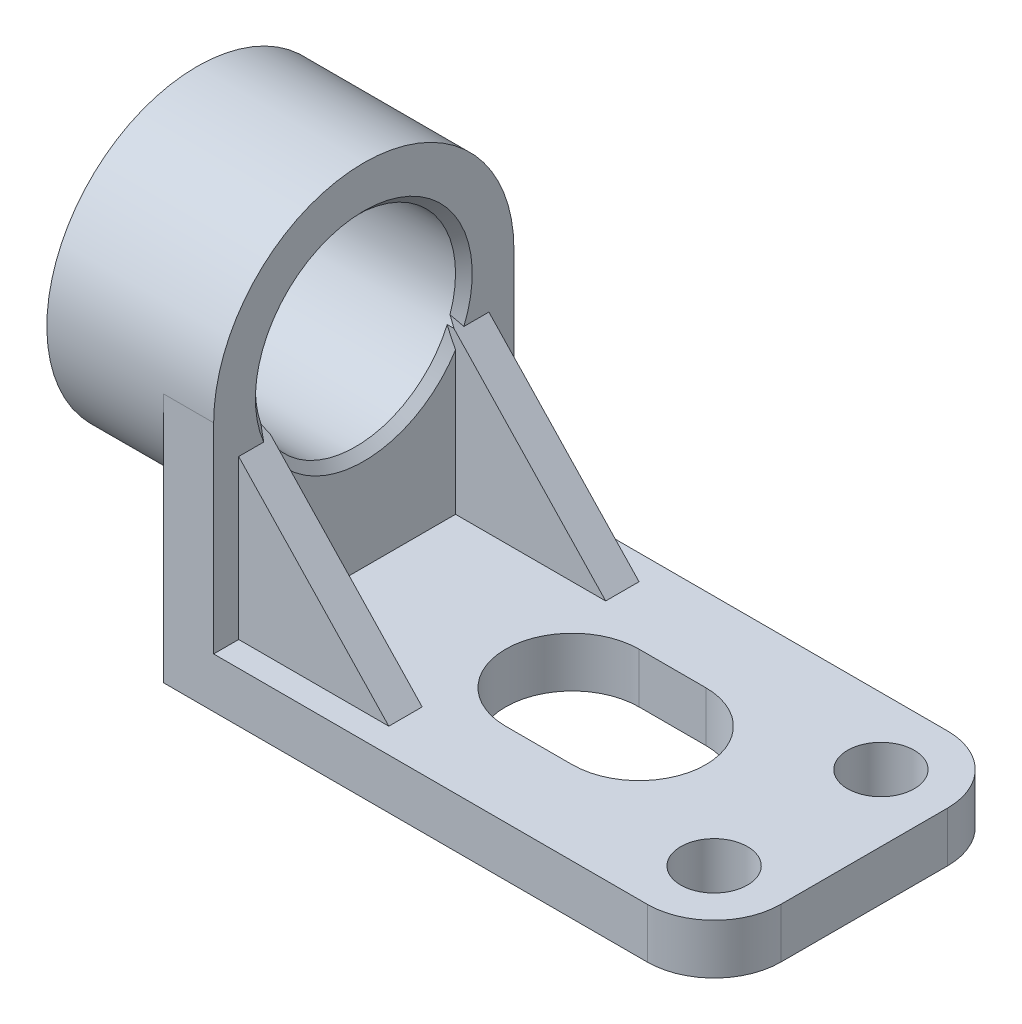
ISO-10303-21;
HEADER;
FILE_DESCRIPTION(('STEP AP214'),'2;1');
FILE_NAME('part.step','',(''),(''),'','','');
FILE_SCHEMA(('AUTOMOTIVE_DESIGN { 1 0 10303 214 1 1 1 1 }'));
ENDSEC;
DATA;
#1=APPLICATION_CONTEXT('core data for automotive mechanical design processes');
#2=APPLICATION_PROTOCOL_DEFINITION('international standard','automotive_design',2000,#1);
#3=PRODUCT_CONTEXT('',#1,'mechanical');
#4=PRODUCT('Part','Part','',(#3));
#5=PRODUCT_RELATED_PRODUCT_CATEGORY('part','',(#4));
#6=PRODUCT_DEFINITION_FORMATION('','',#4);
#7=PRODUCT_DEFINITION_CONTEXT('part definition',#1,'design');
#8=PRODUCT_DEFINITION('design','',#6,#7);
#9=PRODUCT_DEFINITION_SHAPE('','',#8);
#10=(LENGTH_UNIT() NAMED_UNIT(*) SI_UNIT(.MILLI.,.METRE.));
#11=(NAMED_UNIT(*) PLANE_ANGLE_UNIT() SI_UNIT($,.RADIAN.));
#12=(NAMED_UNIT(*) SI_UNIT($,.STERADIAN.) SOLID_ANGLE_UNIT());
#13=UNCERTAINTY_MEASURE_WITH_UNIT(LENGTH_MEASURE(1.E-05),#10,'distance_accuracy_value','');
#14=(GEOMETRIC_REPRESENTATION_CONTEXT(3) GLOBAL_UNCERTAINTY_ASSIGNED_CONTEXT((#13)) GLOBAL_UNIT_ASSIGNED_CONTEXT((#10,
#11,#12)) REPRESENTATION_CONTEXT('',''));
#15=CARTESIAN_POINT('',(0.,0.,0.));
#16=DIRECTION('',(0.,0.,1.));
#17=DIRECTION('',(1.,0.,0.));
#18=AXIS2_PLACEMENT_3D('',#15,#16,#17);
#19=CARTESIAN_POINT('',(66.,6.,36.));
#20=DIRECTION('',(0.,-1.,0.));
#21=DIRECTION('',(1.,0.,0.));
#22=AXIS2_PLACEMENT_3D('',#19,#20,#21);
#23=PLANE('',#22);
#24=DIRECTION('',(1.,0.,0.));
#25=VECTOR('',#24,1.);
#26=CARTESIAN_POINT('',(31.,6.,26.));
#27=LINE('',#26,#25);
#28=CARTESIAN_POINT('',(31.,6.,26.));
#29=VERTEX_POINT('',#28);
#30=CARTESIAN_POINT('',(39.,6.,26.));
#31=VERTEX_POINT('',#30);
#32=EDGE_CURVE('E246',#29,#31,#27,.T.);
#33=ORIENTED_EDGE('',*,*,#32,.F.);
#34=CARTESIAN_POINT('',(31.,6.,18.));
#35=DIRECTION('',(0.,1.,0.));
#36=DIRECTION('',(-1.,0.,0.));
#37=AXIS2_PLACEMENT_3D('',#34,#35,#36);
#38=CIRCLE('',#37,8.);
#39=CARTESIAN_POINT('',(31.,6.,10.));
#40=VERTEX_POINT('',#39);
#41=EDGE_CURVE('E210',#40,#29,#38,.T.);
#42=ORIENTED_EDGE('',*,*,#41,.F.);
#43=DIRECTION('',(-1.,0.,0.));
#44=VECTOR('',#43,1.);
#45=CARTESIAN_POINT('',(31.,6.,10.));
#46=LINE('',#45,#44);
#47=CARTESIAN_POINT('',(39.,6.,10.));
#48=VERTEX_POINT('',#47);
#49=EDGE_CURVE('E230',#48,#40,#46,.T.);
#50=ORIENTED_EDGE('',*,*,#49,.F.);
#51=CARTESIAN_POINT('',(39.,6.,18.));
#52=DIRECTION('',(0.,1.,0.));
#53=DIRECTION('',(-1.,0.,0.));
#54=AXIS2_PLACEMENT_3D('',#51,#52,#53);
#55=CIRCLE('',#54,8.);
#56=EDGE_CURVE('E234',#31,#48,#55,.T.);
#57=ORIENTED_EDGE('',*,*,#56,.F.);
#58=EDGE_LOOP('',(#33,#42,#50,#57));
#59=FACE_BOUND('',#58,.T.);
#60=DIRECTION('',(0.,0.,-1.));
#61=VECTOR('',#60,1.);
#62=CARTESIAN_POINT('',(66.,6.,36.));
#63=LINE('',#62,#61);
#64=CARTESIAN_POINT('',(66.,6.,28.));
#65=VERTEX_POINT('',#64);
#66=CARTESIAN_POINT('',(66.,6.,8.));
#67=VERTEX_POINT('',#66);
#68=EDGE_CURVE('E364',#65,#67,#63,.T.);
#69=ORIENTED_EDGE('',*,*,#68,.T.);
#70=CARTESIAN_POINT('',(58.,6.,8.));
#71=DIRECTION('',(0.,-1.,0.));
#72=DIRECTION('',(1.,0.,0.));
#73=AXIS2_PLACEMENT_3D('',#70,#71,#72);
#74=CIRCLE('',#73,8.);
#75=CARTESIAN_POINT('',(58.,6.,0.));
#76=VERTEX_POINT('',#75);
#77=EDGE_CURVE('E471',#67,#76,#74,.F.);
#78=ORIENTED_EDGE('',*,*,#77,.T.);
#79=DIRECTION('',(-1.,0.,0.));
#80=VECTOR('',#79,1.);
#81=CARTESIAN_POINT('',(66.,6.,0.));
#82=LINE('',#81,#80);
#83=CARTESIAN_POINT('',(6.,5.99999999999999,0.));
#84=VERTEX_POINT('',#83);
#85=EDGE_CURVE('E356',#76,#84,#82,.T.);
#86=ORIENTED_EDGE('',*,*,#85,.T.);
#87=DIRECTION('',(0.,0.,-1.));
#88=VECTOR('',#87,1.);
#89=CARTESIAN_POINT('',(6.,5.99999999999999,36.));
#90=LINE('',#89,#88);
#91=CARTESIAN_POINT('',(6.,5.99999999999999,3.));
#92=VERTEX_POINT('',#91);
#93=EDGE_CURVE('E346',#92,#84,#90,.T.);
#94=ORIENTED_EDGE('',*,*,#93,.F.);
#95=DIRECTION('',(1.,0.,0.));
#96=VECTOR('',#95,1.);
#97=CARTESIAN_POINT('',(24.,6.,3.));
#98=LINE('',#97,#96);
#99=CARTESIAN_POINT('',(24.,5.99999999999999,3.));
#100=VERTEX_POINT('',#99);
#101=EDGE_CURVE('E304',#92,#100,#98,.T.);
#102=ORIENTED_EDGE('',*,*,#101,.T.);
#103=DIRECTION('',(0.,0.,-1.));
#104=VECTOR('',#103,1.);
#105=CARTESIAN_POINT('',(24.,6.,7.));
#106=LINE('',#105,#104);
#107=CARTESIAN_POINT('',(24.,5.99999999999999,7.));
#108=VERTEX_POINT('',#107);
#109=EDGE_CURVE('E312',#108,#100,#106,.T.);
#110=ORIENTED_EDGE('',*,*,#109,.F.);
#111=DIRECTION('',(1.,0.,0.));
#112=VECTOR('',#111,1.);
#113=CARTESIAN_POINT('',(24.,6.,7.));
#114=LINE('',#113,#112);
#115=CARTESIAN_POINT('',(6.,5.99999999999999,7.));
#116=VERTEX_POINT('',#115);
#117=EDGE_CURVE('E292',#116,#108,#114,.T.);
#118=ORIENTED_EDGE('',*,*,#117,.F.);
#119=CARTESIAN_POINT('',(6.,5.99999999999999,29.));
#120=VERTEX_POINT('',#119);
#121=EDGE_CURVE('E365',#120,#116,#90,.T.);
#122=ORIENTED_EDGE('',*,*,#121,.F.);
#123=DIRECTION('',(1.,0.,0.));
#124=VECTOR('',#123,1.);
#125=CARTESIAN_POINT('',(24.,6.,29.));
#126=LINE('',#125,#124);
#127=CARTESIAN_POINT('',(24.,5.99999999999999,29.));
#128=VERTEX_POINT('',#127);
#129=EDGE_CURVE('E269',#120,#128,#126,.T.);
#130=ORIENTED_EDGE('',*,*,#129,.T.);
#131=DIRECTION('',(0.,0.,1.));
#132=VECTOR('',#131,1.);
#133=CARTESIAN_POINT('',(24.,6.,29.));
#134=LINE('',#133,#132);
#135=CARTESIAN_POINT('',(24.,5.99999999999999,33.));
#136=VERTEX_POINT('',#135);
#137=EDGE_CURVE('E272',#128,#136,#134,.T.);
#138=ORIENTED_EDGE('',*,*,#137,.T.);
#139=DIRECTION('',(1.,0.,0.));
#140=VECTOR('',#139,1.);
#141=CARTESIAN_POINT('',(24.,6.,33.));
#142=LINE('',#141,#140);
#143=CARTESIAN_POINT('',(6.,5.99999999999999,33.));
#144=VERTEX_POINT('',#143);
#145=EDGE_CURVE('E265',#144,#136,#142,.T.);
#146=ORIENTED_EDGE('',*,*,#145,.F.);
#147=CARTESIAN_POINT('',(6.,5.99999999999999,36.));
#148=VERTEX_POINT('',#147);
#149=EDGE_CURVE('E361',#148,#144,#90,.T.);
#150=ORIENTED_EDGE('',*,*,#149,.F.);
#151=DIRECTION('',(-1.,0.,0.));
#152=VECTOR('',#151,1.);
#153=CARTESIAN_POINT('',(66.,6.,36.));
#154=LINE('',#153,#152);
#155=CARTESIAN_POINT('',(58.,6.,36.));
#156=VERTEX_POINT('',#155);
#157=EDGE_CURVE('E340',#156,#148,#154,.T.);
#158=ORIENTED_EDGE('',*,*,#157,.F.);
#159=CARTESIAN_POINT('',(58.,6.,28.));
#160=DIRECTION('',(0.,-1.,0.));
#161=DIRECTION('',(1.,0.,0.));
#162=AXIS2_PLACEMENT_3D('',#159,#160,#161);
#163=CIRCLE('',#162,8.);
#164=EDGE_CURVE('E468',#156,#65,#163,.F.);
#165=ORIENTED_EDGE('',*,*,#164,.T.);
#166=EDGE_LOOP('',(#69,#78,#86,#94,#102,#110,#118,#122,#130,#138,#146,#150,#158,#165));
#167=FACE_BOUND('',#166,.T.);
#168=CARTESIAN_POINT('',(58.,6.,28.));
#169=DIRECTION('',(0.,1.,0.));
#170=DIRECTION('',(0.,0.,1.));
#171=AXIS2_PLACEMENT_3D('',#168,#169,#170);
#172=CIRCLE('',#171,4.00000000000001);
#173=CARTESIAN_POINT('',(58.,6.,32.));
#174=VERTEX_POINT('',#173);
#175=EDGE_CURVE('E718',#174,#174,#172,.T.);
#176=ORIENTED_EDGE('',*,*,#175,.F.);
#177=EDGE_LOOP('',(#176));
#178=FACE_BOUND('',#177,.T.);
#179=CARTESIAN_POINT('',(58.,6.,8.));
#180=DIRECTION('',(0.,1.,0.));
#181=DIRECTION('',(0.,0.,1.));
#182=AXIS2_PLACEMENT_3D('',#179,#180,#181);
#183=CIRCLE('',#182,4.00000000000001);
#184=CARTESIAN_POINT('',(58.,6.,12.));
#185=VERTEX_POINT('',#184);
#186=EDGE_CURVE('E713',#185,#185,#183,.T.);
#187=ORIENTED_EDGE('',*,*,#186,.F.);
#188=EDGE_LOOP('',(#187));
#189=FACE_BOUND('',#188,.T.);
#190=ADVANCED_FACE('F49',(#59,#167,#178,#189),#23,.F.);
#191=CARTESIAN_POINT('',(6.,30.,18.));
#192=DIRECTION('',(1.,0.,0.));
#193=DIRECTION('',(0.,0.,-1.));
#194=AXIS2_PLACEMENT_3D('',#191,#192,#193);
#195=CONICAL_SURFACE('',#194,13.,0.785398163397447);
#196=CARTESIAN_POINT('',(4.52683805481986,26.5550042754679,7.));
#197=CARTESIAN_POINT('',(4.61741219515265,26.2520037073432,7.));
#198=CARTESIAN_POINT('',(4.71789676239011,25.9521383609206,7.));
#199=CARTESIAN_POINT('',(4.93564132333157,25.3593713241902,7.));
#200=CARTESIAN_POINT('',(5.05285946883212,25.066454326674,7.));
#201=CARTESIAN_POINT('',(5.30143816416191,24.4869283681925,7.));
#202=CARTESIAN_POINT('',(5.43279182713468,24.2003164166389,7.));
#203=CARTESIAN_POINT('',(5.7077856612305,23.6321598015335,7.));
#204=CARTESIAN_POINT('',(5.85145528681877,23.3506293516368,7.));
#205=CARTESIAN_POINT('',(6.,23.0717967697244,7.));
#206=B_SPLINE_CURVE_WITH_KNOTS('',3,(#196,#197,#198,#199,#200,#201,#202,#203,#204,#205),
.UNSPECIFIED.,.F.,.F.,(4,2,2,2,4),(0.,0.948337859718804,1.89434431502451,2.83989194275113,
3.78776761231351),.UNSPECIFIED.);
#207=CARTESIAN_POINT('',(4.99999999999998,25.2041684766872,7.));
#208=VERTEX_POINT('',#207);
#209=CARTESIAN_POINT('',(6.,23.0717967697244,7.));
#210=VERTEX_POINT('',#209);
#211=EDGE_CURVE('E439',#208,#210,#206,.T.);
#212=ORIENTED_EDGE('',*,*,#211,.F.);
#213=CARTESIAN_POINT('',(4.99999999999998,30.,18.));
#214=DIRECTION('',(-1.,0.,0.));
#215=DIRECTION('',(0.,0.,1.));
#216=AXIS2_PLACEMENT_3D('',#213,#214,#215);
#217=CIRCLE('',#216,12.);
#218=CARTESIAN_POINT('',(4.99999999999998,25.2041684766872,29.));
#219=VERTEX_POINT('',#218);
#220=EDGE_CURVE('E377',#219,#208,#217,.F.);
#221=ORIENTED_EDGE('',*,*,#220,.F.);
#222=CARTESIAN_POINT('',(6.,23.0717967697244,29.));
#223=CARTESIAN_POINT('',(5.85145528681877,23.3506293516368,29.));
#224=CARTESIAN_POINT('',(5.7077856612305,23.6321598015335,29.));
#225=CARTESIAN_POINT('',(5.43279182713468,24.2003164166389,29.));
#226=CARTESIAN_POINT('',(5.30143816416191,24.4869283681925,29.));
#227=CARTESIAN_POINT('',(5.05285946883212,25.066454326674,29.));
#228=CARTESIAN_POINT('',(4.93564132333156,25.3593713241902,29.));
#229=CARTESIAN_POINT('',(4.71789676239011,25.9521383609206,29.));
#230=CARTESIAN_POINT('',(4.61741219515265,26.2520037073432,29.));
#231=CARTESIAN_POINT('',(4.52683805481986,26.5550042754679,29.));
#232=B_SPLINE_CURVE_WITH_KNOTS('',3,(#222,#223,#224,#225,#226,#227,#228,#229,#230,#231),
.UNSPECIFIED.,.F.,.F.,(4,2,2,2,4),(0.,0.947875669562385,1.893423297289,2.83942975259471,
3.78776761231352),.UNSPECIFIED.);
#233=CARTESIAN_POINT('',(6.,23.0717967697244,29.));
#234=VERTEX_POINT('',#233);
#235=EDGE_CURVE('E398',#234,#219,#232,.T.);
#236=ORIENTED_EDGE('',*,*,#235,.F.);
#237=CARTESIAN_POINT('',(6.,30.,18.));
#238=DIRECTION('',(-1.,0.,0.));
#239=DIRECTION('',(0.,-1.,0.));
#240=AXIS2_PLACEMENT_3D('',#237,#238,#239);
#241=CIRCLE('',#240,13.);
#242=EDGE_CURVE('E394',#210,#234,#241,.T.);
#243=ORIENTED_EDGE('',*,*,#242,.F.);
#244=EDGE_LOOP('',(#212,#221,#236,#243));
#245=FACE_BOUND('',#244,.T.);
#246=ADVANCED_FACE('F522',(#245),#195,.F.);
#247=CARTESIAN_POINT('',(6.,5.99999999999999,36.));
#248=DIRECTION('',(-1.,0.,0.));
#249=DIRECTION('',(0.,-1.,0.));
#250=AXIS2_PLACEMENT_3D('',#247,#248,#249);
#251=PLANE('',#250);
#252=DIRECTION('',(0.,-1.,0.));
#253=VECTOR('',#252,1.);
#254=CARTESIAN_POINT('',(6.,5.99999999999999,7.));
#255=LINE('',#254,#253);
#256=EDGE_CURVE('E289',#210,#116,#255,.T.);
#257=ORIENTED_EDGE('',*,*,#256,.F.);
#258=ORIENTED_EDGE('',*,*,#242,.T.);
#259=DIRECTION('',(0.,-1.,0.));
#260=VECTOR('',#259,1.);
#261=CARTESIAN_POINT('',(6.,5.99999999999999,29.));
#262=LINE('',#261,#260);
#263=EDGE_CURVE('E261',#234,#120,#262,.T.);
#264=ORIENTED_EDGE('',*,*,#263,.T.);
#265=ORIENTED_EDGE('',*,*,#121,.T.);
#266=EDGE_LOOP('',(#257,#258,#264,#265));
#267=FACE_BOUND('',#266,.T.);
#268=ADVANCED_FACE('F507',(#267),#251,.F.);
#269=CARTESIAN_POINT('',(-14.,30.,18.));
#270=DIRECTION('',(1.,0.,0.));
#271=DIRECTION('',(0.,1.,0.));
#272=AXIS2_PLACEMENT_3D('',#269,#270,#271);
#273=PLANE('',#272);
#274=CARTESIAN_POINT('',(-14.,30.,18.));
#275=DIRECTION('',(1.,0.,0.));
#276=DIRECTION('',(0.,1.,0.));
#277=AXIS2_PLACEMENT_3D('',#274,#275,#276);
#278=CIRCLE('',#277,13.);
#279=CARTESIAN_POINT('',(-14.,43.,18.));
#280=VERTEX_POINT('',#279);
#281=EDGE_CURVE('E386',#280,#280,#278,.T.);
#282=ORIENTED_EDGE('',*,*,#281,.T.);
#283=EDGE_LOOP('',(#282));
#284=FACE_BOUND('',#283,.T.);
#285=CARTESIAN_POINT('',(-14.,30.,18.));
#286=DIRECTION('',(1.,0.,0.));
#287=DIRECTION('',(0.,1.,0.));
#288=AXIS2_PLACEMENT_3D('',#285,#286,#287);
#289=CIRCLE('',#288,18.);
#290=CARTESIAN_POINT('',(-14.,48.,18.));
#291=VERTEX_POINT('',#290);
#292=EDGE_CURVE('E317',#291,#291,#289,.T.);
#293=ORIENTED_EDGE('',*,*,#292,.F.);
#294=EDGE_LOOP('',(#293));
#295=FACE_BOUND('',#294,.T.);
#296=ADVANCED_FACE('F565',(#284,#295),#273,.F.);
#297=CARTESIAN_POINT('',(0.,30.,36.));
#298=DIRECTION('',(1.,0.,0.));
#299=DIRECTION('',(0.,1.,0.));
#300=AXIS2_PLACEMENT_3D('',#297,#298,#299);
#301=PLANE('',#300);
#302=DIRECTION('',(0.,-1.,0.));
#303=VECTOR('',#302,1.);
#304=CARTESIAN_POINT('',(0.,30.,36.));
#305=LINE('',#304,#303);
#306=CARTESIAN_POINT('',(0.,30.,36.));
#307=VERTEX_POINT('',#306);
#308=CARTESIAN_POINT('',(0.,0.,36.));
#309=VERTEX_POINT('',#308);
#310=EDGE_CURVE('E333',#307,#309,#305,.T.);
#311=ORIENTED_EDGE('',*,*,#310,.F.);
#312=CARTESIAN_POINT('',(0.,30.,18.));
#313=DIRECTION('',(1.,0.,0.));
#314=DIRECTION('',(0.,1.,0.));
#315=AXIS2_PLACEMENT_3D('',#312,#313,#314);
#316=CIRCLE('',#315,18.);
#317=CARTESIAN_POINT('',(0.,30.,0.));
#318=VERTEX_POINT('',#317);
#319=EDGE_CURVE('E321',#307,#318,#316,.T.);
#320=ORIENTED_EDGE('',*,*,#319,.T.);
#321=DIRECTION('',(0.,-1.,0.));
#322=VECTOR('',#321,1.);
#323=CARTESIAN_POINT('',(0.,30.,0.));
#324=LINE('',#323,#322);
#325=CARTESIAN_POINT('',(0.,0.,0.));
#326=VERTEX_POINT('',#325);
#327=EDGE_CURVE('E350',#318,#326,#324,.T.);
#328=ORIENTED_EDGE('',*,*,#327,.T.);
#329=DIRECTION('',(0.,0.,-1.));
#330=VECTOR('',#329,1.);
#331=CARTESIAN_POINT('',(0.,0.,36.));
#332=LINE('',#331,#330);
#333=EDGE_CURVE('E373',#309,#326,#332,.T.);
#334=ORIENTED_EDGE('',*,*,#333,.F.);
#335=EDGE_LOOP('',(#311,#320,#328,#334));
#336=FACE_BOUND('',#335,.T.);
#337=ADVANCED_FACE('F537',(#336),#301,.F.);
#338=CARTESIAN_POINT('',(0.,0.,36.));
#339=DIRECTION('',(0.,1.,0.));
#340=DIRECTION('',(0.,0.,1.));
#341=AXIS2_PLACEMENT_3D('',#338,#339,#340);
#342=PLANE('',#341);
#343=CARTESIAN_POINT('',(58.,0.,8.));
#344=DIRECTION('',(0.,1.,0.));
#345=DIRECTION('',(0.,0.,1.));
#346=AXIS2_PLACEMENT_3D('',#343,#344,#345);
#347=CIRCLE('',#346,4.00000000000001);
#348=CARTESIAN_POINT('',(58.,0.,12.));
#349=VERTEX_POINT('',#348);
#350=EDGE_CURVE('E710',#349,#349,#347,.T.);
#351=ORIENTED_EDGE('',*,*,#350,.T.);
#352=EDGE_LOOP('',(#351));
#353=FACE_BOUND('',#352,.T.);
#354=CARTESIAN_POINT('',(58.,0.,28.));
#355=DIRECTION('',(0.,1.,0.));
#356=DIRECTION('',(0.,0.,1.));
#357=AXIS2_PLACEMENT_3D('',#354,#355,#356);
#358=CIRCLE('',#357,4.00000000000001);
#359=CARTESIAN_POINT('',(58.,0.,32.));
#360=VERTEX_POINT('',#359);
#361=EDGE_CURVE('E237',#360,#360,#358,.T.);
#362=ORIENTED_EDGE('',*,*,#361,.T.);
#363=EDGE_LOOP('',(#362));
#364=FACE_BOUND('',#363,.T.);
#365=DIRECTION('',(-1.,0.,0.));
#366=VECTOR('',#365,1.);
#367=CARTESIAN_POINT('',(31.,0.,10.));
#368=LINE('',#367,#366);
#369=CARTESIAN_POINT('',(39.,0.,10.));
#370=VERTEX_POINT('',#369);
#371=CARTESIAN_POINT('',(31.,0.,10.));
#372=VERTEX_POINT('',#371);
#373=EDGE_CURVE('E216',#370,#372,#368,.T.);
#374=ORIENTED_EDGE('',*,*,#373,.T.);
#375=CARTESIAN_POINT('',(31.,0.,18.));
#376=DIRECTION('',(0.,1.,0.));
#377=DIRECTION('',(-1.,0.,0.));
#378=AXIS2_PLACEMENT_3D('',#375,#376,#377);
#379=CIRCLE('',#378,8.);
#380=CARTESIAN_POINT('',(31.,0.,26.));
#381=VERTEX_POINT('',#380);
#382=EDGE_CURVE('E207',#372,#381,#379,.T.);
#383=ORIENTED_EDGE('',*,*,#382,.T.);
#384=DIRECTION('',(1.,0.,0.));
#385=VECTOR('',#384,1.);
#386=CARTESIAN_POINT('',(31.,0.,26.));
#387=LINE('',#386,#385);
#388=CARTESIAN_POINT('',(39.,0.,26.));
#389=VERTEX_POINT('',#388);
#390=EDGE_CURVE('E220',#381,#389,#387,.T.);
#391=ORIENTED_EDGE('',*,*,#390,.T.);
#392=CARTESIAN_POINT('',(39.,0.,18.));
#393=DIRECTION('',(0.,1.,0.));
#394=DIRECTION('',(-1.,0.,0.));
#395=AXIS2_PLACEMENT_3D('',#392,#393,#394);
#396=CIRCLE('',#395,8.);
#397=EDGE_CURVE('E225',#389,#370,#396,.T.);
#398=ORIENTED_EDGE('',*,*,#397,.T.);
#399=EDGE_LOOP('',(#374,#383,#391,#398));
#400=FACE_BOUND('',#399,.T.);
#401=DIRECTION('',(1.,0.,0.));
#402=VECTOR('',#401,1.);
#403=CARTESIAN_POINT('',(0.,0.,0.));
#404=LINE('',#403,#402);
#405=CARTESIAN_POINT('',(58.,0.,0.));
#406=VERTEX_POINT('',#405);
#407=EDGE_CURVE('E353',#326,#406,#404,.T.);
#408=ORIENTED_EDGE('',*,*,#407,.T.);
#409=CARTESIAN_POINT('',(58.,0.,8.));
#410=DIRECTION('',(0.,1.,0.));
#411=DIRECTION('',(0.,0.,1.));
#412=AXIS2_PLACEMENT_3D('',#409,#410,#411);
#413=CIRCLE('',#412,8.);
#414=CARTESIAN_POINT('',(66.,0.,8.));
#415=VERTEX_POINT('',#414);
#416=EDGE_CURVE('E58',#406,#415,#413,.F.);
#417=ORIENTED_EDGE('',*,*,#416,.T.);
#418=DIRECTION('',(0.,0.,-1.));
#419=VECTOR('',#418,1.);
#420=CARTESIAN_POINT('',(66.,0.,36.));
#421=LINE('',#420,#419);
#422=CARTESIAN_POINT('',(66.,0.,28.));
#423=VERTEX_POINT('',#422);
#424=EDGE_CURVE('E369',#423,#415,#421,.T.);
#425=ORIENTED_EDGE('',*,*,#424,.F.);
#426=CARTESIAN_POINT('',(58.,0.,28.));
#427=DIRECTION('',(0.,1.,0.));
#428=DIRECTION('',(0.,0.,1.));
#429=AXIS2_PLACEMENT_3D('',#426,#427,#428);
#430=CIRCLE('',#429,8.);
#431=CARTESIAN_POINT('',(58.,0.,36.));
#432=VERTEX_POINT('',#431);
#433=EDGE_CURVE('E65',#423,#432,#430,.F.);
#434=ORIENTED_EDGE('',*,*,#433,.T.);
#435=DIRECTION('',(1.,0.,0.));
#436=VECTOR('',#435,1.);
#437=CARTESIAN_POINT('',(0.,0.,36.));
#438=LINE('',#437,#436);
#439=EDGE_CURVE('E337',#309,#432,#438,.T.);
#440=ORIENTED_EDGE('',*,*,#439,.F.);
#441=ORIENTED_EDGE('',*,*,#333,.T.);
#442=EDGE_LOOP('',(#408,#417,#425,#434,#440,#441));
#443=FACE_BOUND('',#442,.T.);
#444=ADVANCED_FACE('F227',(#353,#364,#400,#443),#342,.F.);
#445=CARTESIAN_POINT('',(66.,0.,36.));
#446=DIRECTION('',(-1.,0.,0.));
#447=DIRECTION('',(0.,0.,1.));
#448=AXIS2_PLACEMENT_3D('',#445,#446,#447);
#449=PLANE('',#448);
#450=ORIENTED_EDGE('',*,*,#424,.T.);
#451=DIRECTION('',(0.,1.,0.));
#452=VECTOR('',#451,1.);
#453=CARTESIAN_POINT('',(66.,0.,8.));
#454=LINE('',#453,#452);
#455=EDGE_CURVE('E464',#415,#67,#454,.T.);
#456=ORIENTED_EDGE('',*,*,#455,.T.);
#457=ORIENTED_EDGE('',*,*,#68,.F.);
#458=DIRECTION('',(0.,1.,0.));
#459=VECTOR('',#458,1.);
#460=CARTESIAN_POINT('',(66.,0.,28.));
#461=LINE('',#460,#459);
#462=EDGE_CURVE('E461',#65,#423,#461,.F.);
#463=ORIENTED_EDGE('',*,*,#462,.T.);
#464=EDGE_LOOP('',(#450,#456,#457,#463));
#465=FACE_BOUND('',#464,.T.);
#466=ADVANCED_FACE('F482',(#465),#449,.F.);
#467=DIRECTION('',(0.,0.,1.));
#468=VECTOR('',#467,1.);
#469=CARTESIAN_POINT('',(6.,25.,29.));
#470=LINE('',#469,#468);
#471=CARTESIAN_POINT('',(6.,25.,30.));
#472=VERTEX_POINT('',#471);
#473=CARTESIAN_POINT('',(6.,25.,33.));
#474=VERTEX_POINT('',#473);
#475=EDGE_CURVE('E285',#472,#474,#470,.T.);
#476=ORIENTED_EDGE('',*,*,#475,.F.);
#477=CARTESIAN_POINT('',(6.,30.,18.));
#478=DIRECTION('',(-1.,0.,0.));
#479=DIRECTION('',(0.,-1.,0.));
#480=AXIS2_PLACEMENT_3D('',#477,#478,#479);
#481=CIRCLE('',#480,13.);
#482=CARTESIAN_POINT('',(6.,25.,5.99999999999996));
#483=VERTEX_POINT('',#482);
#484=EDGE_CURVE('E390',#472,#483,#481,.T.);
#485=ORIENTED_EDGE('',*,*,#484,.T.);
#486=DIRECTION('',(0.,0.,-1.));
#487=VECTOR('',#486,1.);
#488=CARTESIAN_POINT('',(6.,25.,7.));
#489=LINE('',#488,#487);
#490=CARTESIAN_POINT('',(6.,25.,3.));
#491=VERTEX_POINT('',#490);
#492=EDGE_CURVE('E301',#483,#491,#489,.T.);
#493=ORIENTED_EDGE('',*,*,#492,.T.);
#494=DIRECTION('',(0.,-1.,0.));
#495=VECTOR('',#494,1.);
#496=CARTESIAN_POINT('',(6.,5.99999999999999,3.));
#497=LINE('',#496,#495);
#498=EDGE_CURVE('E288',#491,#92,#497,.T.);
#499=ORIENTED_EDGE('',*,*,#498,.T.);
#500=ORIENTED_EDGE('',*,*,#93,.T.);
#501=DIRECTION('',(0.,1.,0.));
#502=VECTOR('',#501,1.);
#503=CARTESIAN_POINT('',(6.,5.99999999999999,0.));
#504=LINE('',#503,#502);
#505=CARTESIAN_POINT('',(6.,30.,0.));
#506=VERTEX_POINT('',#505);
#507=EDGE_CURVE('E334',#84,#506,#504,.T.);
#508=ORIENTED_EDGE('',*,*,#507,.T.);
#509=CARTESIAN_POINT('',(6.,30.,18.));
#510=DIRECTION('',(1.,0.,0.));
#511=DIRECTION('',(0.,1.,0.));
#512=AXIS2_PLACEMENT_3D('',#509,#510,#511);
#513=CIRCLE('',#512,18.);
#514=CARTESIAN_POINT('',(6.,30.,36.));
#515=VERTEX_POINT('',#514);
#516=EDGE_CURVE('E316',#506,#515,#513,.T.);
#517=ORIENTED_EDGE('',*,*,#516,.T.);
#518=DIRECTION('',(0.,1.,0.));
#519=VECTOR('',#518,1.);
#520=CARTESIAN_POINT('',(6.,5.99999999999999,36.));
#521=LINE('',#520,#519);
#522=EDGE_CURVE('E343',#148,#515,#521,.T.);
#523=ORIENTED_EDGE('',*,*,#522,.F.);
#524=ORIENTED_EDGE('',*,*,#149,.T.);
#525=DIRECTION('',(0.,-1.,0.));
#526=VECTOR('',#525,1.);
#527=CARTESIAN_POINT('',(6.,5.99999999999999,33.));
#528=LINE('',#527,#526);
#529=EDGE_CURVE('E255',#474,#144,#528,.T.);
#530=ORIENTED_EDGE('',*,*,#529,.F.);
#531=EDGE_LOOP('',(#476,#485,#493,#499,#500,#508,#517,#523,#524,#530));
#532=FACE_BOUND('',#531,.T.);
#533=ADVANCED_FACE('F496',(#532),#251,.F.);
#534=CARTESIAN_POINT('',(0.,0.,36.));
#535=DIRECTION('',(0.,0.,1.));
#536=DIRECTION('',(1.,0.,0.));
#537=AXIS2_PLACEMENT_3D('',#534,#535,#536);
#538=PLANE('',#537);
#539=ORIENTED_EDGE('',*,*,#439,.T.);
#540=DIRECTION('',(0.,1.,0.));
#541=VECTOR('',#540,1.);
#542=CARTESIAN_POINT('',(58.,6.,36.));
#543=LINE('',#542,#541);
#544=EDGE_CURVE('E11',#432,#156,#543,.T.);
#545=ORIENTED_EDGE('',*,*,#544,.T.);
#546=ORIENTED_EDGE('',*,*,#157,.T.);
#547=ORIENTED_EDGE('',*,*,#522,.T.);
#548=DIRECTION('',(-1.,0.,0.));
#549=VECTOR('',#548,1.);
#550=CARTESIAN_POINT('',(6.,30.,36.));
#551=LINE('',#550,#549);
#552=EDGE_CURVE('E329',#515,#307,#551,.T.);
#553=ORIENTED_EDGE('',*,*,#552,.T.);
#554=ORIENTED_EDGE('',*,*,#310,.T.);
#555=EDGE_LOOP('',(#539,#545,#546,#547,#553,#554));
#556=FACE_BOUND('',#555,.T.);
#557=ADVANCED_FACE('F532',(#556),#538,.T.);
#558=CARTESIAN_POINT('',(0.,0.,0.));
#559=DIRECTION('',(0.,0.,1.));
#560=DIRECTION('',(1.,0.,0.));
#561=AXIS2_PLACEMENT_3D('',#558,#559,#560);
#562=PLANE('',#561);
#563=ORIENTED_EDGE('',*,*,#85,.F.);
#564=DIRECTION('',(0.,1.,0.));
#565=VECTOR('',#564,1.);
#566=CARTESIAN_POINT('',(58.,0.,0.));
#567=LINE('',#566,#565);
#568=EDGE_CURVE('E73',#76,#406,#567,.F.);
#569=ORIENTED_EDGE('',*,*,#568,.T.);
#570=ORIENTED_EDGE('',*,*,#407,.F.);
#571=ORIENTED_EDGE('',*,*,#327,.F.);
#572=DIRECTION('',(-1.,0.,0.));
#573=VECTOR('',#572,1.);
#574=CARTESIAN_POINT('',(6.,30.,0.));
#575=LINE('',#574,#573);
#576=EDGE_CURVE('E328',#506,#318,#575,.T.);
#577=ORIENTED_EDGE('',*,*,#576,.F.);
#578=ORIENTED_EDGE('',*,*,#507,.F.);
#579=EDGE_LOOP('',(#563,#569,#570,#571,#577,#578));
#580=FACE_BOUND('',#579,.T.);
#581=ADVANCED_FACE('F491',(#580),#562,.F.);
#582=CARTESIAN_POINT('',(-14.,30.,18.));
#583=DIRECTION('',(1.,0.,0.));
#584=DIRECTION('',(0.,1.,0.));
#585=AXIS2_PLACEMENT_3D('',#582,#583,#584);
#586=CYLINDRICAL_SURFACE('',#585,18.);
#587=ORIENTED_EDGE('',*,*,#292,.T.);
#588=EDGE_LOOP('',(#587));
#589=FACE_BOUND('',#588,.T.);
#590=ORIENTED_EDGE('',*,*,#552,.F.);
#591=ORIENTED_EDGE('',*,*,#516,.F.);
#592=ORIENTED_EDGE('',*,*,#576,.T.);
#593=ORIENTED_EDGE('',*,*,#319,.F.);
#594=EDGE_LOOP('',(#590,#591,#592,#593));
#595=FACE_BOUND('',#594,.T.);
#596=ADVANCED_FACE('F535',(#589,#595),#586,.T.);
#597=CARTESIAN_POINT('',(6.,25.,7.));
#598=DIRECTION('',(-0.725952683905827,-0.687744647910783,0.));
#599=DIRECTION('',(0.687744647910783,-0.725952683905827,0.));
#600=AXIS2_PLACEMENT_3D('',#597,#598,#599);
#601=PLANE('',#600);
#602=DIRECTION('',(-0.687744647910783,0.725952683905827,0.));
#603=VECTOR('',#602,1.);
#604=CARTESIAN_POINT('',(6.,25.,3.));
#605=LINE('',#604,#603);
#606=EDGE_CURVE('E293',#100,#491,#605,.T.);
#607=ORIENTED_EDGE('',*,*,#606,.T.);
#608=ORIENTED_EDGE('',*,*,#492,.F.);
#609=CARTESIAN_POINT('',(73.6216216216176,-46.3783783783741,18.));
#610=DIRECTION('',(-0.725952683905827,-0.687744647910783,0.));
#611=DIRECTION('',(0.687744647910783,-0.725952683905827,0.));
#612=AXIS2_PLACEMENT_3D('',#609,#610,#611);
#613=ELLIPSE('',#612,111.056303542885,25.8106410069405);
#614=CARTESIAN_POINT('',(4.99999999999998,26.0555555555556,6.66680283306197));
#615=VERTEX_POINT('',#614);
#616=EDGE_CURVE('E447',#483,#615,#613,.F.);
#617=ORIENTED_EDGE('',*,*,#616,.T.);
#618=CARTESIAN_POINT('',(1.26315789473684,30.,18.));
#619=DIRECTION('',(-0.725952683905827,-0.687744647910783,0.));
#620=DIRECTION('',(-0.687744647910783,0.725952683905827,0.));
#621=AXIS2_PLACEMENT_3D('',#618,#619,#620);
#622=ELLIPSE('',#621,16.5300029410136,12.);
#623=CARTESIAN_POINT('',(5.80657723261208,25.2041684766872,7.));
#624=VERTEX_POINT('',#623);
#625=EDGE_CURVE('E458',#624,#615,#622,.F.);
#626=ORIENTED_EDGE('',*,*,#625,.F.);
#627=DIRECTION('',(-0.687744647910783,0.725952683905827,0.));
#628=VECTOR('',#627,1.);
#629=CARTESIAN_POINT('',(6.,25.,7.));
#630=LINE('',#629,#628);
#631=EDGE_CURVE('E297',#108,#624,#630,.T.);
#632=ORIENTED_EDGE('',*,*,#631,.F.);
#633=ORIENTED_EDGE('',*,*,#109,.T.);
#634=EDGE_LOOP('',(#607,#608,#617,#626,#632,#633));
#635=FACE_BOUND('',#634,.T.);
#636=ADVANCED_FACE('F435',(#635),#601,.F.);
#637=CARTESIAN_POINT('',(0.,0.,7.));
#638=DIRECTION('',(0.,0.,1.));
#639=DIRECTION('',(1.,0.,0.));
#640=AXIS2_PLACEMENT_3D('',#637,#638,#639);
#641=PLANE('',#640);
#642=ORIENTED_EDGE('',*,*,#631,.T.);
#643=DIRECTION('',(-1.,0.,0.));
#644=VECTOR('',#643,1.);
#645=CARTESIAN_POINT('',(-14.,25.2041684766872,7.));
#646=LINE('',#645,#644);
#647=EDGE_CURVE('E454',#208,#624,#646,.F.);
#648=ORIENTED_EDGE('',*,*,#647,.F.);
#649=ORIENTED_EDGE('',*,*,#211,.T.);
#650=ORIENTED_EDGE('',*,*,#256,.T.);
#651=ORIENTED_EDGE('',*,*,#117,.T.);
#652=EDGE_LOOP('',(#642,#648,#649,#650,#651));
#653=FACE_BOUND('',#652,.T.);
#654=ADVANCED_FACE('F431',(#653),#641,.T.);
#655=CARTESIAN_POINT('',(0.,0.,3.));
#656=DIRECTION('',(0.,0.,1.));
#657=DIRECTION('',(1.,0.,0.));
#658=AXIS2_PLACEMENT_3D('',#655,#656,#657);
#659=PLANE('',#658);
#660=ORIENTED_EDGE('',*,*,#498,.F.);
#661=ORIENTED_EDGE('',*,*,#606,.F.);
#662=ORIENTED_EDGE('',*,*,#101,.F.);
#663=EDGE_LOOP('',(#660,#661,#662));
#664=FACE_BOUND('',#663,.T.);
#665=ADVANCED_FACE('F429',(#664),#659,.F.);
#666=CARTESIAN_POINT('',(6.,25.,29.));
#667=DIRECTION('',(0.725952683905827,0.687744647910783,0.));
#668=DIRECTION('',(-0.687744647910783,0.725952683905827,0.));
#669=AXIS2_PLACEMENT_3D('',#666,#667,#668);
#670=PLANE('',#669);
#671=DIRECTION('',(-0.687744647910783,0.725952683905827,0.));
#672=VECTOR('',#671,1.);
#673=CARTESIAN_POINT('',(6.,25.,33.));
#674=LINE('',#673,#672);
#675=EDGE_CURVE('E276',#136,#474,#674,.T.);
#676=ORIENTED_EDGE('',*,*,#675,.F.);
#677=ORIENTED_EDGE('',*,*,#137,.F.);
#678=DIRECTION('',(-0.687744647910783,0.725952683905827,0.));
#679=VECTOR('',#678,1.);
#680=CARTESIAN_POINT('',(6.,25.,29.));
#681=LINE('',#680,#679);
#682=CARTESIAN_POINT('',(5.80657723261209,25.2041684766872,29.));
#683=VERTEX_POINT('',#682);
#684=EDGE_CURVE('E264',#128,#683,#681,.T.);
#685=ORIENTED_EDGE('',*,*,#684,.T.);
#686=CARTESIAN_POINT('',(1.26315789473684,30.,18.));
#687=DIRECTION('',(0.725952683905827,0.687744647910783,0.));
#688=DIRECTION('',(-0.687744647910783,0.725952683905827,0.));
#689=AXIS2_PLACEMENT_3D('',#686,#687,#688);
#690=ELLIPSE('',#689,16.5300029410136,12.);
#691=CARTESIAN_POINT('',(4.99999999999998,26.0555555555556,29.333197166938));
#692=VERTEX_POINT('',#691);
#693=EDGE_CURVE('E451',#683,#692,#690,.F.);
#694=ORIENTED_EDGE('',*,*,#693,.T.);
#695=CARTESIAN_POINT('',(73.6216216216176,-46.3783783783741,18.));
#696=DIRECTION('',(0.725952683905827,0.687744647910783,0.));
#697=DIRECTION('',(0.687744647910783,-0.725952683905827,0.));
#698=AXIS2_PLACEMENT_3D('',#695,#696,#697);
#699=ELLIPSE('',#698,111.056303542885,25.8106410069405);
#700=EDGE_CURVE('E408',#692,#472,#699,.T.);
#701=ORIENTED_EDGE('',*,*,#700,.T.);
#702=ORIENTED_EDGE('',*,*,#475,.T.);
#703=EDGE_LOOP('',(#676,#677,#685,#694,#701,#702));
#704=FACE_BOUND('',#703,.T.);
#705=ADVANCED_FACE('F420',(#704),#670,.T.);
#706=CARTESIAN_POINT('',(0.,0.,29.));
#707=DIRECTION('',(0.,0.,-1.));
#708=DIRECTION('',(1.,0.,0.));
#709=AXIS2_PLACEMENT_3D('',#706,#707,#708);
#710=PLANE('',#709);
#711=ORIENTED_EDGE('',*,*,#263,.F.);
#712=ORIENTED_EDGE('',*,*,#235,.T.);
#713=DIRECTION('',(-1.,0.,0.));
#714=VECTOR('',#713,1.);
#715=CARTESIAN_POINT('',(-14.,25.2041684766872,29.));
#716=LINE('',#715,#714);
#717=EDGE_CURVE('E446',#219,#683,#716,.F.);
#718=ORIENTED_EDGE('',*,*,#717,.T.);
#719=ORIENTED_EDGE('',*,*,#684,.F.);
#720=ORIENTED_EDGE('',*,*,#129,.F.);
#721=EDGE_LOOP('',(#711,#712,#718,#719,#720));
#722=FACE_BOUND('',#721,.T.);
#723=ADVANCED_FACE('F414',(#722),#710,.T.);
#724=CARTESIAN_POINT('',(0.,0.,33.));
#725=DIRECTION('',(0.,0.,-1.));
#726=DIRECTION('',(1.,0.,0.));
#727=AXIS2_PLACEMENT_3D('',#724,#725,#726);
#728=PLANE('',#727);
#729=ORIENTED_EDGE('',*,*,#529,.T.);
#730=ORIENTED_EDGE('',*,*,#145,.T.);
#731=ORIENTED_EDGE('',*,*,#675,.T.);
#732=EDGE_LOOP('',(#729,#730,#731));
#733=FACE_BOUND('',#732,.T.);
#734=ADVANCED_FACE('F419',(#733),#728,.F.);
#735=CARTESIAN_POINT('',(-14.,30.,18.));
#736=DIRECTION('',(-1.,0.,0.));
#737=DIRECTION('',(0.,0.,1.));
#738=AXIS2_PLACEMENT_3D('',#735,#736,#737);
#739=CYLINDRICAL_SURFACE('',#738,12.);
#740=CARTESIAN_POINT('',(-13.,30.,18.));
#741=DIRECTION('',(1.,0.,0.));
#742=DIRECTION('',(0.,0.,-1.));
#743=AXIS2_PLACEMENT_3D('',#740,#741,#742);
#744=CIRCLE('',#743,12.);
#745=CARTESIAN_POINT('',(-13.,30.,5.99999999999998));
#746=VERTEX_POINT('',#745);
#747=EDGE_CURVE('E382',#746,#746,#744,.F.);
#748=ORIENTED_EDGE('',*,*,#747,.T.);
#749=EDGE_LOOP('',(#748));
#750=FACE_BOUND('',#749,.T.);
#751=EDGE_CURVE('E378',#615,#692,#217,.F.);
#752=ORIENTED_EDGE('',*,*,#751,.T.);
#753=ORIENTED_EDGE('',*,*,#693,.F.);
#754=ORIENTED_EDGE('',*,*,#717,.F.);
#755=ORIENTED_EDGE('',*,*,#220,.T.);
#756=ORIENTED_EDGE('',*,*,#647,.T.);
#757=ORIENTED_EDGE('',*,*,#625,.T.);
#758=EDGE_LOOP('',(#752,#753,#754,#755,#756,#757));
#759=FACE_BOUND('',#758,.T.);
#760=ADVANCED_FACE('F422',(#750,#759),#739,.F.);
#761=CARTESIAN_POINT('',(-13.,30.,18.));
#762=DIRECTION('',(-1.,0.,0.));
#763=DIRECTION('',(0.,0.,1.));
#764=AXIS2_PLACEMENT_3D('',#761,#762,#763);
#765=CONICAL_SURFACE('',#764,12.,0.785398163397454);
#766=ORIENTED_EDGE('',*,*,#281,.F.);
#767=EDGE_LOOP('',(#766));
#768=FACE_BOUND('',#767,.T.);
#769=ORIENTED_EDGE('',*,*,#747,.F.);
#770=EDGE_LOOP('',(#769));
#771=FACE_BOUND('',#770,.T.);
#772=ADVANCED_FACE('F567',(#768,#771),#765,.F.);
#773=ORIENTED_EDGE('',*,*,#751,.F.);
#774=ORIENTED_EDGE('',*,*,#616,.F.);
#775=ORIENTED_EDGE('',*,*,#484,.F.);
#776=ORIENTED_EDGE('',*,*,#700,.F.);
#777=EDGE_LOOP('',(#773,#774,#775,#776));
#778=FACE_BOUND('',#777,.T.);
#779=ADVANCED_FACE('F411',(#778),#195,.F.);
#780=CARTESIAN_POINT('',(31.,0.,18.));
#781=DIRECTION('',(0.,1.,0.));
#782=DIRECTION('',(-1.,0.,0.));
#783=AXIS2_PLACEMENT_3D('',#780,#781,#782);
#784=CYLINDRICAL_SURFACE('',#783,8.);
#785=ORIENTED_EDGE('',*,*,#41,.T.);
#786=DIRECTION('',(0.,1.,0.));
#787=VECTOR('',#786,1.);
#788=CARTESIAN_POINT('',(31.,0.,26.));
#789=LINE('',#788,#787);
#790=EDGE_CURVE('E203',#381,#29,#789,.T.);
#791=ORIENTED_EDGE('',*,*,#790,.F.);
#792=ORIENTED_EDGE('',*,*,#382,.F.);
#793=DIRECTION('',(0.,1.,0.));
#794=VECTOR('',#793,1.);
#795=CARTESIAN_POINT('',(31.,0.,10.));
#796=LINE('',#795,#794);
#797=EDGE_CURVE('E252',#372,#40,#796,.T.);
#798=ORIENTED_EDGE('',*,*,#797,.T.);
#799=EDGE_LOOP('',(#785,#791,#792,#798));
#800=FACE_BOUND('',#799,.T.);
#801=ADVANCED_FACE('F205',(#800),#784,.F.);
#802=CARTESIAN_POINT('',(31.,0.,10.));
#803=DIRECTION('',(0.,0.,-1.));
#804=DIRECTION('',(-1.,0.,0.));
#805=AXIS2_PLACEMENT_3D('',#802,#803,#804);
#806=PLANE('',#805);
#807=ORIENTED_EDGE('',*,*,#49,.T.);
#808=ORIENTED_EDGE('',*,*,#797,.F.);
#809=ORIENTED_EDGE('',*,*,#373,.F.);
#810=DIRECTION('',(0.,1.,0.));
#811=VECTOR('',#810,1.);
#812=CARTESIAN_POINT('',(39.,0.,10.));
#813=LINE('',#812,#811);
#814=EDGE_CURVE('E256',#370,#48,#813,.T.);
#815=ORIENTED_EDGE('',*,*,#814,.T.);
#816=EDGE_LOOP('',(#807,#808,#809,#815));
#817=FACE_BOUND('',#816,.T.);
#818=ADVANCED_FACE('F649',(#817),#806,.F.);
#819=CARTESIAN_POINT('',(39.,0.,18.));
#820=DIRECTION('',(0.,1.,0.));
#821=DIRECTION('',(-1.,0.,0.));
#822=AXIS2_PLACEMENT_3D('',#819,#820,#821);
#823=CYLINDRICAL_SURFACE('',#822,8.);
#824=ORIENTED_EDGE('',*,*,#56,.T.);
#825=ORIENTED_EDGE('',*,*,#814,.F.);
#826=ORIENTED_EDGE('',*,*,#397,.F.);
#827=DIRECTION('',(0.,1.,0.));
#828=VECTOR('',#827,1.);
#829=CARTESIAN_POINT('',(39.,0.,26.));
#830=LINE('',#829,#828);
#831=EDGE_CURVE('E215',#389,#31,#830,.T.);
#832=ORIENTED_EDGE('',*,*,#831,.T.);
#833=EDGE_LOOP('',(#824,#825,#826,#832));
#834=FACE_BOUND('',#833,.T.);
#835=ADVANCED_FACE('F657',(#834),#823,.F.);
#836=CARTESIAN_POINT('',(31.,0.,26.));
#837=DIRECTION('',(0.,0.,1.));
#838=DIRECTION('',(1.,0.,0.));
#839=AXIS2_PLACEMENT_3D('',#836,#837,#838);
#840=PLANE('',#839);
#841=ORIENTED_EDGE('',*,*,#32,.T.);
#842=ORIENTED_EDGE('',*,*,#831,.F.);
#843=ORIENTED_EDGE('',*,*,#390,.F.);
#844=ORIENTED_EDGE('',*,*,#790,.T.);
#845=EDGE_LOOP('',(#841,#842,#843,#844));
#846=FACE_BOUND('',#845,.T.);
#847=ADVANCED_FACE('F221',(#846),#840,.F.);
#848=CARTESIAN_POINT('',(58.,0.,8.));
#849=DIRECTION('',(0.,1.,0.));
#850=DIRECTION('',(0.,0.,1.));
#851=AXIS2_PLACEMENT_3D('',#848,#849,#850);
#852=CYLINDRICAL_SURFACE('',#851,8.);
#853=ORIENTED_EDGE('',*,*,#416,.F.);
#854=ORIENTED_EDGE('',*,*,#568,.F.);
#855=ORIENTED_EDGE('',*,*,#77,.F.);
#856=ORIENTED_EDGE('',*,*,#455,.F.);
#857=EDGE_LOOP('',(#853,#854,#855,#856));
#858=FACE_BOUND('',#857,.T.);
#859=ADVANCED_FACE('F485',(#858),#852,.T.);
#860=CARTESIAN_POINT('',(58.,0.,28.));
#861=DIRECTION('',(0.,-1.,0.));
#862=DIRECTION('',(0.,0.,-1.));
#863=AXIS2_PLACEMENT_3D('',#860,#861,#862);
#864=CYLINDRICAL_SURFACE('',#863,8.);
#865=ORIENTED_EDGE('',*,*,#433,.F.);
#866=ORIENTED_EDGE('',*,*,#462,.F.);
#867=ORIENTED_EDGE('',*,*,#164,.F.);
#868=ORIENTED_EDGE('',*,*,#544,.F.);
#869=EDGE_LOOP('',(#865,#866,#867,#868));
#870=FACE_BOUND('',#869,.T.);
#871=ADVANCED_FACE('F51',(#870),#864,.T.);
#872=CARTESIAN_POINT('',(58.,6.,28.));
#873=DIRECTION('',(0.,1.,0.));
#874=DIRECTION('',(0.,0.,1.));
#875=AXIS2_PLACEMENT_3D('',#872,#873,#874);
#876=CYLINDRICAL_SURFACE('',#875,4.00000000000001);
#877=ORIENTED_EDGE('',*,*,#361,.F.);
#878=EDGE_LOOP('',(#877));
#879=FACE_BOUND('',#878,.T.);
#880=ORIENTED_EDGE('',*,*,#175,.T.);
#881=EDGE_LOOP('',(#880));
#882=FACE_BOUND('',#881,.T.);
#883=ADVANCED_FACE('F542',(#879,#882),#876,.F.);
#884=CARTESIAN_POINT('',(58.,6.,8.));
#885=DIRECTION('',(0.,1.,0.));
#886=DIRECTION('',(0.,0.,1.));
#887=AXIS2_PLACEMENT_3D('',#884,#885,#886);
#888=CYLINDRICAL_SURFACE('',#887,4.00000000000001);
#889=ORIENTED_EDGE('',*,*,#350,.F.);
#890=EDGE_LOOP('',(#889));
#891=FACE_BOUND('',#890,.T.);
#892=ORIENTED_EDGE('',*,*,#186,.T.);
#893=EDGE_LOOP('',(#892));
#894=FACE_BOUND('',#893,.T.);
#895=ADVANCED_FACE('F548',(#891,#894),#888,.F.);
#896=CLOSED_SHELL('',(#190,#246,#268,#296,#337,#444,#466,#533,#557,#581,#596,#636,#654,#665,
#705,#723,#734,#760,#772,#779,#801,#818,#835,#847,#859,#871,#883,#895));
#897=MANIFOLD_SOLID_BREP('B2',#896);
#898=ADVANCED_BREP_SHAPE_REPRESENTATION('',(#18,#897),#14);
#899=SHAPE_DEFINITION_REPRESENTATION(#9,#898);
ENDSEC;
END-ISO-10303-21;
